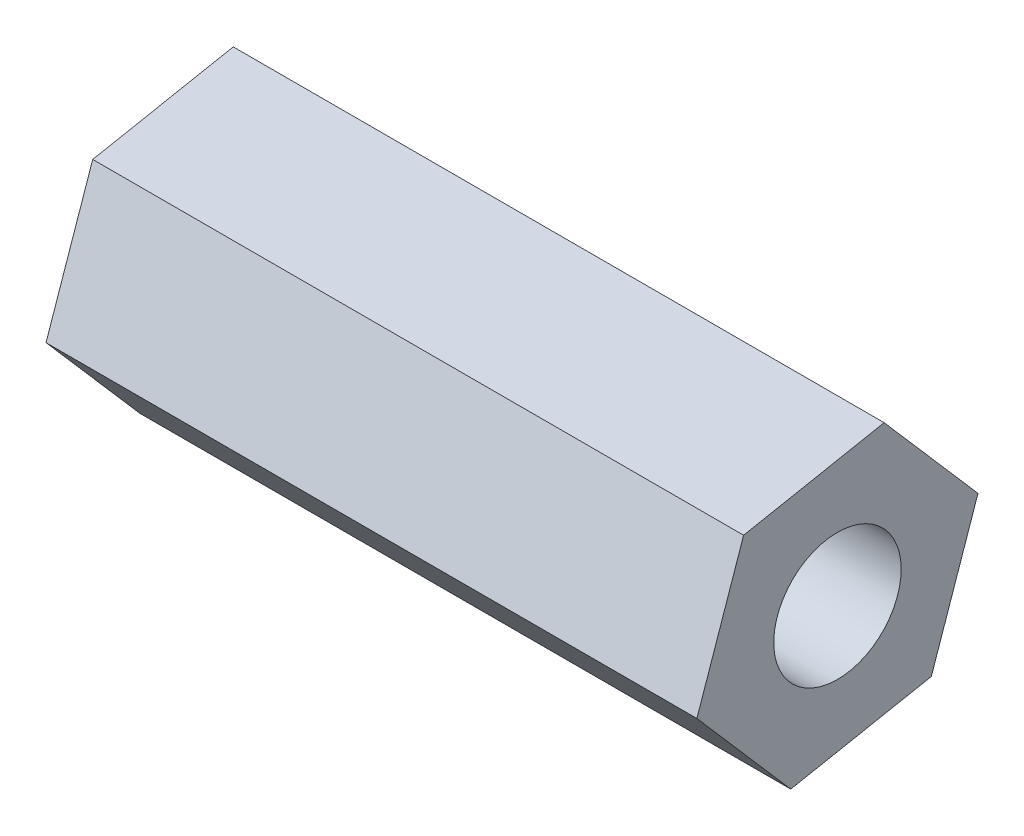
ISO-10303-21;
HEADER;
FILE_DESCRIPTION(('STEP AP214'),'2;1');
FILE_NAME('part.step','',(''),(''),'','','');
FILE_SCHEMA(('AUTOMOTIVE_DESIGN { 1 0 10303 214 1 1 1 1 }'));
ENDSEC;
DATA;
#1=APPLICATION_CONTEXT('core data for automotive mechanical design processes');
#2=APPLICATION_PROTOCOL_DEFINITION('international standard','automotive_design',2000,#1);
#3=PRODUCT_CONTEXT('',#1,'mechanical');
#4=PRODUCT('Part','Part','',(#3));
#5=PRODUCT_RELATED_PRODUCT_CATEGORY('part','',(#4));
#6=PRODUCT_DEFINITION_FORMATION('','',#4);
#7=PRODUCT_DEFINITION_CONTEXT('part definition',#1,'design');
#8=PRODUCT_DEFINITION('design','',#6,#7);
#9=PRODUCT_DEFINITION_SHAPE('','',#8);
#10=(LENGTH_UNIT() NAMED_UNIT(*) SI_UNIT(.MILLI.,.METRE.));
#11=(NAMED_UNIT(*) PLANE_ANGLE_UNIT() SI_UNIT($,.RADIAN.));
#12=(NAMED_UNIT(*) SI_UNIT($,.STERADIAN.) SOLID_ANGLE_UNIT());
#13=UNCERTAINTY_MEASURE_WITH_UNIT(LENGTH_MEASURE(1.E-05),#10,'distance_accuracy_value','');
#14=(GEOMETRIC_REPRESENTATION_CONTEXT(3) GLOBAL_UNCERTAINTY_ASSIGNED_CONTEXT((#13)) GLOBAL_UNIT_ASSIGNED_CONTEXT((#10,
#11,#12)) REPRESENTATION_CONTEXT('',''));
#15=CARTESIAN_POINT('',(0.,0.,0.));
#16=DIRECTION('',(0.,0.,1.));
#17=DIRECTION('',(1.,0.,0.));
#18=AXIS2_PLACEMENT_3D('',#15,#16,#17);
#19=CARTESIAN_POINT('',(33.3375,6.93101609017103,-2.39256124083035));
#20=DIRECTION('',(0.,-0.981775035427216,-0.190046783218998));
#21=DIRECTION('',(0.,0.190046783218998,-0.981775035427216));
#22=AXIS2_PLACEMENT_3D('',#19,#20,#21);
#23=PLANE('',#22);
#24=DIRECTION('',(0.,-0.190046783218998,0.981775035427216));
#25=VECTOR('',#24,1.);
#26=CARTESIAN_POINT('',(0.,6.93101609017103,-2.39256124083035));
#27=LINE('',#26,#25);
#28=CARTESIAN_POINT('',(0.,6.93101609017103,-2.39256124083035));
#29=VERTEX_POINT('',#28);
#30=CARTESIAN_POINT('',(0.,5.53752685975462,4.80615538771163));
#31=VERTEX_POINT('',#30);
#32=EDGE_CURVE('E121',#29,#31,#27,.T.);
#33=ORIENTED_EDGE('',*,*,#32,.T.);
#34=DIRECTION('',(-1.,0.,0.));
#35=VECTOR('',#34,1.);
#36=CARTESIAN_POINT('',(33.3375,5.53752685975462,4.80615538771163));
#37=LINE('',#36,#35);
#38=CARTESIAN_POINT('',(33.3375,5.53752685975462,4.80615538771163));
#39=VERTEX_POINT('',#38);
#40=EDGE_CURVE('E11',#39,#31,#37,.T.);
#41=ORIENTED_EDGE('',*,*,#40,.F.);
#42=DIRECTION('',(0.,-0.190046783218998,0.981775035427216));
#43=VECTOR('',#42,1.);
#44=CARTESIAN_POINT('',(33.3375,6.93101609017103,-2.39256124083035));
#45=LINE('',#44,#43);
#46=CARTESIAN_POINT('',(33.3375,6.93101609017103,-2.39256124083035));
#47=VERTEX_POINT('',#46);
#48=EDGE_CURVE('E131',#47,#39,#45,.T.);
#49=ORIENTED_EDGE('',*,*,#48,.F.);
#50=DIRECTION('',(-1.,0.,0.));
#51=VECTOR('',#50,1.);
#52=CARTESIAN_POINT('',(33.3375,6.93101609017103,-2.39256124083035));
#53=LINE('',#52,#51);
#54=EDGE_CURVE('E117',#47,#29,#53,.T.);
#55=ORIENTED_EDGE('',*,*,#54,.T.);
#56=EDGE_LOOP('',(#33,#41,#49,#55));
#57=FACE_BOUND('',#56,.T.);
#58=ADVANCED_FACE('F36',(#57),#23,.F.);
#59=CARTESIAN_POINT('',(33.3375,5.53752685975462,4.80615538771163));
#60=DIRECTION('',(0.,-0.326302175538441,-0.945265513090835));
#61=DIRECTION('',(0.,0.945265513090836,-0.326302175538441));
#62=AXIS2_PLACEMENT_3D('',#59,#60,#61);
#63=PLANE('',#62);
#64=DIRECTION('',(0.,-0.945265513090835,0.326302175538441));
#65=VECTOR('',#64,1.);
#66=CARTESIAN_POINT('',(0.,5.53752685975462,4.80615538771163));
#67=LINE('',#66,#65);
#68=CARTESIAN_POINT('',(0.,-1.39348923041641,7.19871662854198));
#69=VERTEX_POINT('',#68);
#70=EDGE_CURVE('E124',#31,#69,#67,.T.);
#71=ORIENTED_EDGE('',*,*,#70,.T.);
#72=DIRECTION('',(-1.,0.,0.));
#73=VECTOR('',#72,1.);
#74=CARTESIAN_POINT('',(33.3375,-1.39348923041641,7.19871662854198));
#75=LINE('',#74,#73);
#76=CARTESIAN_POINT('',(33.3375,-1.39348923041641,7.19871662854198));
#77=VERTEX_POINT('',#76);
#78=EDGE_CURVE('E45',#77,#69,#75,.T.);
#79=ORIENTED_EDGE('',*,*,#78,.F.);
#80=DIRECTION('',(0.,-0.945265513090835,0.326302175538441));
#81=VECTOR('',#80,1.);
#82=CARTESIAN_POINT('',(33.3375,5.53752685975462,4.80615538771163));
#83=LINE('',#82,#81);
#84=EDGE_CURVE('E90',#39,#77,#83,.T.);
#85=ORIENTED_EDGE('',*,*,#84,.F.);
#86=ORIENTED_EDGE('',*,*,#40,.T.);
#87=EDGE_LOOP('',(#71,#79,#85,#86));
#88=FACE_BOUND('',#87,.T.);
#89=ADVANCED_FACE('F157',(#88),#63,.F.);
#90=CARTESIAN_POINT('',(33.3375,-1.39348923041641,7.19871662854198));
#91=DIRECTION('',(0.,0.655472859888775,-0.755218729871837));
#92=DIRECTION('',(0.,0.755218729871837,0.655472859888775));
#93=AXIS2_PLACEMENT_3D('',#90,#91,#92);
#94=PLANE('',#93);
#95=DIRECTION('',(0.,-0.755218729871837,-0.655472859888775));
#96=VECTOR('',#95,1.);
#97=CARTESIAN_POINT('',(0.,-1.39348923041641,7.19871662854198));
#98=LINE('',#97,#96);
#99=CARTESIAN_POINT('',(0.,-6.93101609017103,2.39256124083034));
#100=VERTEX_POINT('',#99);
#101=EDGE_CURVE('E126',#69,#100,#98,.T.);
#102=ORIENTED_EDGE('',*,*,#101,.T.);
#103=DIRECTION('',(-1.,0.,0.));
#104=VECTOR('',#103,1.);
#105=CARTESIAN_POINT('',(33.3375,-6.93101609017103,2.39256124083034));
#106=LINE('',#105,#104);
#107=CARTESIAN_POINT('',(33.3375,-6.93101609017103,2.39256124083034));
#108=VERTEX_POINT('',#107);
#109=EDGE_CURVE('E112',#108,#100,#106,.T.);
#110=ORIENTED_EDGE('',*,*,#109,.F.);
#111=DIRECTION('',(0.,-0.755218729871837,-0.655472859888775));
#112=VECTOR('',#111,1.);
#113=CARTESIAN_POINT('',(33.3375,-1.39348923041641,7.19871662854198));
#114=LINE('',#113,#112);
#115=EDGE_CURVE('E103',#77,#108,#114,.T.);
#116=ORIENTED_EDGE('',*,*,#115,.F.);
#117=ORIENTED_EDGE('',*,*,#78,.T.);
#118=EDGE_LOOP('',(#102,#110,#116,#117));
#119=FACE_BOUND('',#118,.T.);
#120=ADVANCED_FACE('F138',(#119),#94,.F.);
#121=CARTESIAN_POINT('',(33.3375,-6.93101609017103,2.39256124083034));
#122=DIRECTION('',(0.,0.981775035427216,0.190046783218998));
#123=DIRECTION('',(0.,-0.190046783218998,0.981775035427216));
#124=AXIS2_PLACEMENT_3D('',#121,#122,#123);
#125=PLANE('',#124);
#126=DIRECTION('',(0.,0.190046783218999,-0.981775035427216));
#127=VECTOR('',#126,1.);
#128=CARTESIAN_POINT('',(0.,-6.93101609017103,2.39256124083034));
#129=LINE('',#128,#127);
#130=CARTESIAN_POINT('',(0.,-5.53752685975462,-4.80615538771163));
#131=VERTEX_POINT('',#130);
#132=EDGE_CURVE('E111',#100,#131,#129,.T.);
#133=ORIENTED_EDGE('',*,*,#132,.T.);
#134=DIRECTION('',(-1.,0.,0.));
#135=VECTOR('',#134,1.);
#136=CARTESIAN_POINT('',(33.3375,-5.53752685975462,-4.80615538771163));
#137=LINE('',#136,#135);
#138=CARTESIAN_POINT('',(33.3375,-5.53752685975462,-4.80615538771163));
#139=VERTEX_POINT('',#138);
#140=EDGE_CURVE('E108',#139,#131,#137,.T.);
#141=ORIENTED_EDGE('',*,*,#140,.F.);
#142=DIRECTION('',(0.,0.190046783218999,-0.981775035427216));
#143=VECTOR('',#142,1.);
#144=CARTESIAN_POINT('',(33.3375,-6.93101609017103,2.39256124083034));
#145=LINE('',#144,#143);
#146=EDGE_CURVE('E97',#108,#139,#145,.T.);
#147=ORIENTED_EDGE('',*,*,#146,.F.);
#148=ORIENTED_EDGE('',*,*,#109,.T.);
#149=EDGE_LOOP('',(#133,#141,#147,#148));
#150=FACE_BOUND('',#149,.T.);
#151=ADVANCED_FACE('F109',(#150),#125,.F.);
#152=CARTESIAN_POINT('',(33.3375,-5.53752685975462,-4.80615538771163));
#153=DIRECTION('',(0.,0.326302175538441,0.945265513090835));
#154=DIRECTION('',(0.,-0.945265513090836,0.326302175538441));
#155=AXIS2_PLACEMENT_3D('',#152,#153,#154);
#156=PLANE('',#155);
#157=DIRECTION('',(0.,0.945265513090836,-0.326302175538441));
#158=VECTOR('',#157,1.);
#159=CARTESIAN_POINT('',(0.,-5.53752685975462,-4.80615538771163));
#160=LINE('',#159,#158);
#161=CARTESIAN_POINT('',(0.,1.39348923041641,-7.19871662854198));
#162=VERTEX_POINT('',#161);
#163=EDGE_CURVE('E76',#131,#162,#160,.T.);
#164=ORIENTED_EDGE('',*,*,#163,.T.);
#165=DIRECTION('',(-1.,0.,0.));
#166=VECTOR('',#165,1.);
#167=CARTESIAN_POINT('',(33.3375,1.39348923041641,-7.19871662854198));
#168=LINE('',#167,#166);
#169=CARTESIAN_POINT('',(33.3375,1.39348923041641,-7.19871662854198));
#170=VERTEX_POINT('',#169);
#171=EDGE_CURVE('E113',#170,#162,#168,.T.);
#172=ORIENTED_EDGE('',*,*,#171,.F.);
#173=DIRECTION('',(0.,0.945265513090836,-0.326302175538441));
#174=VECTOR('',#173,1.);
#175=CARTESIAN_POINT('',(33.3375,-5.53752685975462,-4.80615538771163));
#176=LINE('',#175,#174);
#177=EDGE_CURVE('E101',#139,#170,#176,.T.);
#178=ORIENTED_EDGE('',*,*,#177,.F.);
#179=ORIENTED_EDGE('',*,*,#140,.T.);
#180=EDGE_LOOP('',(#164,#172,#178,#179));
#181=FACE_BOUND('',#180,.T.);
#182=ADVANCED_FACE('F115',(#181),#156,.F.);
#183=CARTESIAN_POINT('',(33.3375,1.39348923041641,-7.19871662854198));
#184=DIRECTION('',(0.,-0.655472859888775,0.755218729871837));
#185=DIRECTION('',(0.,-0.755218729871837,-0.655472859888775));
#186=AXIS2_PLACEMENT_3D('',#183,#184,#185);
#187=PLANE('',#186);
#188=DIRECTION('',(0.,0.755218729871837,0.655472859888775));
#189=VECTOR('',#188,1.);
#190=CARTESIAN_POINT('',(0.,1.39348923041641,-7.19871662854198));
#191=LINE('',#190,#189);
#192=EDGE_CURVE('E82',#162,#29,#191,.T.);
#193=ORIENTED_EDGE('',*,*,#192,.T.);
#194=ORIENTED_EDGE('',*,*,#54,.F.);
#195=DIRECTION('',(0.,0.755218729871837,0.655472859888775));
#196=VECTOR('',#195,1.);
#197=CARTESIAN_POINT('',(33.3375,1.39348923041641,-7.19871662854198));
#198=LINE('',#197,#196);
#199=EDGE_CURVE('E53',#170,#47,#198,.T.);
#200=ORIENTED_EDGE('',*,*,#199,.F.);
#201=ORIENTED_EDGE('',*,*,#171,.T.);
#202=EDGE_LOOP('',(#193,#194,#200,#201));
#203=FACE_BOUND('',#202,.T.);
#204=ADVANCED_FACE('F145',(#203),#187,.F.);
#205=CARTESIAN_POINT('',(33.3375,0.,0.));
#206=DIRECTION('',(1.,0.,0.));
#207=DIRECTION('',(0.,0.,-1.));
#208=AXIS2_PLACEMENT_3D('',#205,#206,#207);
#209=PLANE('',#208);
#210=CARTESIAN_POINT('',(33.3375,0.,0.));
#211=DIRECTION('',(1.,0.,0.));
#212=DIRECTION('',(0.,0.,-1.));
#213=AXIS2_PLACEMENT_3D('',#210,#211,#212);
#214=CIRCLE('',#213,3.2639);
#215=CARTESIAN_POINT('',(33.3375,0.,-3.2639));
#216=VERTEX_POINT('',#215);
#217=EDGE_CURVE('E210',#216,#216,#214,.T.);
#218=ORIENTED_EDGE('',*,*,#217,.F.);
#219=EDGE_LOOP('',(#218));
#220=FACE_BOUND('',#219,.T.);
#221=ORIENTED_EDGE('',*,*,#48,.T.);
#222=ORIENTED_EDGE('',*,*,#84,.T.);
#223=ORIENTED_EDGE('',*,*,#115,.T.);
#224=ORIENTED_EDGE('',*,*,#146,.T.);
#225=ORIENTED_EDGE('',*,*,#177,.T.);
#226=ORIENTED_EDGE('',*,*,#199,.T.);
#227=EDGE_LOOP('',(#221,#222,#223,#224,#225,#226));
#228=FACE_BOUND('',#227,.T.);
#229=ADVANCED_FACE('F99',(#220,#228),#209,.T.);
#230=CARTESIAN_POINT('',(0.,0.,0.));
#231=DIRECTION('',(1.,0.,0.));
#232=DIRECTION('',(0.,0.,-1.));
#233=AXIS2_PLACEMENT_3D('',#230,#231,#232);
#234=PLANE('',#233);
#235=CARTESIAN_POINT('',(0.,0.,0.));
#236=DIRECTION('',(1.,0.,0.));
#237=DIRECTION('',(0.,0.,-1.));
#238=AXIS2_PLACEMENT_3D('',#235,#236,#237);
#239=CIRCLE('',#238,3.2639);
#240=CARTESIAN_POINT('',(0.,0.,-3.2639));
#241=VERTEX_POINT('',#240);
#242=EDGE_CURVE('E39',#241,#241,#239,.T.);
#243=ORIENTED_EDGE('',*,*,#242,.T.);
#244=EDGE_LOOP('',(#243));
#245=FACE_BOUND('',#244,.T.);
#246=ORIENTED_EDGE('',*,*,#32,.F.);
#247=ORIENTED_EDGE('',*,*,#192,.F.);
#248=ORIENTED_EDGE('',*,*,#163,.F.);
#249=ORIENTED_EDGE('',*,*,#132,.F.);
#250=ORIENTED_EDGE('',*,*,#101,.F.);
#251=ORIENTED_EDGE('',*,*,#70,.F.);
#252=EDGE_LOOP('',(#246,#247,#248,#249,#250,#251));
#253=FACE_BOUND('',#252,.T.);
#254=ADVANCED_FACE('F141',(#245,#253),#234,.F.);
#255=CARTESIAN_POINT('',(-4.7625,0.,0.));
#256=DIRECTION('',(1.,0.,0.));
#257=DIRECTION('',(0.,0.,-1.));
#258=AXIS2_PLACEMENT_3D('',#255,#256,#257);
#259=CYLINDRICAL_SURFACE('',#258,3.2639);
#260=CARTESIAN_POINT('',(33.3375,0.,-3.2639));
#261=CARTESIAN_POINT('',(32.990234375,0.,-3.2639));
#262=CARTESIAN_POINT('',(32.64296875,0.,-3.2639));
#263=CARTESIAN_POINT('',(31.9484375,0.,-3.2639));
#264=CARTESIAN_POINT('',(31.601171875,0.,-3.2639));
#265=CARTESIAN_POINT('',(30.906640625,0.,-3.2639));
#266=CARTESIAN_POINT('',(30.559375,0.,-3.2639));
#267=CARTESIAN_POINT('',(29.86484375,0.,-3.2639));
#268=CARTESIAN_POINT('',(29.517578125,0.,-3.2639));
#269=CARTESIAN_POINT('',(28.823046875,0.,-3.2639));
#270=CARTESIAN_POINT('',(28.47578125,0.,-3.2639));
#271=CARTESIAN_POINT('',(27.78125,0.,-3.2639));
#272=CARTESIAN_POINT('',(27.433984375,0.,-3.2639));
#273=CARTESIAN_POINT('',(26.739453125,0.,-3.2639));
#274=CARTESIAN_POINT('',(26.3921875,0.,-3.2639));
#275=CARTESIAN_POINT('',(25.69765625,0.,-3.2639));
#276=CARTESIAN_POINT('',(25.350390625,0.,-3.2639));
#277=CARTESIAN_POINT('',(24.655859375,0.,-3.2639));
#278=CARTESIAN_POINT('',(24.30859375,0.,-3.2639));
#279=CARTESIAN_POINT('',(23.6140625,0.,-3.2639));
#280=CARTESIAN_POINT('',(23.266796875,0.,-3.2639));
#281=CARTESIAN_POINT('',(22.572265625,0.,-3.2639));
#282=CARTESIAN_POINT('',(22.225,0.,-3.2639));
#283=CARTESIAN_POINT('',(21.53046875,0.,-3.2639));
#284=CARTESIAN_POINT('',(21.183203125,0.,-3.2639));
#285=CARTESIAN_POINT('',(20.488671875,0.,-3.2639));
#286=CARTESIAN_POINT('',(20.14140625,0.,-3.2639));
#287=CARTESIAN_POINT('',(19.446875,0.,-3.2639));
#288=CARTESIAN_POINT('',(19.099609375,0.,-3.2639));
#289=CARTESIAN_POINT('',(18.405078125,0.,-3.2639));
#290=CARTESIAN_POINT('',(18.0578125,0.,-3.2639));
#291=CARTESIAN_POINT('',(17.36328125,0.,-3.2639));
#292=CARTESIAN_POINT('',(17.016015625,0.,-3.2639));
#293=CARTESIAN_POINT('',(16.321484375,0.,-3.2639));
#294=CARTESIAN_POINT('',(15.97421875,0.,-3.2639));
#295=CARTESIAN_POINT('',(15.2796875,0.,-3.2639));
#296=CARTESIAN_POINT('',(14.932421875,0.,-3.2639));
#297=CARTESIAN_POINT('',(14.237890625,0.,-3.2639));
#298=CARTESIAN_POINT('',(13.890625,0.,-3.2639));
#299=CARTESIAN_POINT('',(13.19609375,0.,-3.2639));
#300=CARTESIAN_POINT('',(12.848828125,0.,-3.2639));
#301=CARTESIAN_POINT('',(12.154296875,0.,-3.2639));
#302=CARTESIAN_POINT('',(11.80703125,0.,-3.2639));
#303=CARTESIAN_POINT('',(11.1125,0.,-3.2639));
#304=CARTESIAN_POINT('',(10.765234375,0.,-3.2639));
#305=CARTESIAN_POINT('',(10.070703125,0.,-3.2639));
#306=CARTESIAN_POINT('',(9.7234375,0.,-3.2639));
#307=CARTESIAN_POINT('',(9.02890625,0.,-3.2639));
#308=CARTESIAN_POINT('',(8.681640625,0.,-3.2639));
#309=CARTESIAN_POINT('',(7.987109375,0.,-3.2639));
#310=CARTESIAN_POINT('',(7.63984375,0.,-3.2639));
#311=CARTESIAN_POINT('',(6.9453125,0.,-3.2639));
#312=CARTESIAN_POINT('',(6.598046875,0.,-3.2639));
#313=CARTESIAN_POINT('',(5.903515625,0.,-3.2639));
#314=CARTESIAN_POINT('',(5.55625,0.,-3.2639));
#315=CARTESIAN_POINT('',(4.86171875,0.,-3.2639));
#316=CARTESIAN_POINT('',(4.514453125,0.,-3.2639));
#317=CARTESIAN_POINT('',(3.819921875,0.,-3.2639));
#318=CARTESIAN_POINT('',(3.47265625,0.,-3.2639));
#319=CARTESIAN_POINT('',(2.778125,0.,-3.2639));
#320=CARTESIAN_POINT('',(2.430859375,0.,-3.2639));
#321=CARTESIAN_POINT('',(1.736328125,0.,-3.2639));
#322=CARTESIAN_POINT('',(1.3890625,0.,-3.2639));
#323=CARTESIAN_POINT('',(0.69453125,0.,-3.2639));
#324=CARTESIAN_POINT('',(0.347265625,0.,-3.2639));
#325=CARTESIAN_POINT('',(0.,0.,-3.2639));
#326=B_SPLINE_CURVE_WITH_KNOTS('',3,(#260,#261,#262,#263,#264,#265,#266,#267,#268,#269,#270,
#271,#272,#273,#274,#275,#276,#277,#278,#279,#280,#281,#282,#283,#284,#285,#286,#287,#288,#289,
#290,#291,#292,#293,#294,#295,#296,#297,#298,#299,#300,#301,#302,#303,#304,#305,#306,#307,#308,
#309,#310,#311,#312,#313,#314,#315,#316,#317,#318,#319,#320,#321,#322,#323,#324,#325),
.UNSPECIFIED.,.F.,.F.,(4,2,2,2,2,2,2,2,2,2,2,2,2,2,2,2,2,2,2,2,2,2,2,2,2,2,2,2,2,2,2,2,4),(0.,
1.041796875,2.08359375,3.125390625,4.1671875,5.208984375,6.25078125,7.292578125,8.334375,
9.376171875,10.41796875,11.459765625,12.5015625,13.543359375,14.58515625,15.626953125,16.66875,
17.710546875,18.75234375,19.794140625,20.8359375,21.877734375,22.91953125,23.961328125,
25.003125,26.044921875,27.08671875,28.128515625,29.1703125,30.212109375,31.25390625,
32.295703125,33.3375),.UNSPECIFIED.);
#327=EDGE_CURVE('BSEAM194',#216,#241,#326,.T.);
#328=ORIENTED_EDGE('',*,*,#217,.T.);
#329=ORIENTED_EDGE('',*,*,#242,.F.);
#330=ORIENTED_EDGE('',*,*,#327,.T.);
#331=ORIENTED_EDGE('',*,*,#327,.F.);
#332=EDGE_LOOP('',(#328,#330,#329,#331));
#333=FACE_BOUND('',#332,.T.);
#334=ADVANCED_FACE('F194',(#333),#259,.F.);
#335=CLOSED_SHELL('',(#58,#89,#120,#151,#182,#204,#229,#254,#334));
#336=MANIFOLD_SOLID_BREP('B2',#335);
#337=ADVANCED_BREP_SHAPE_REPRESENTATION('',(#18,#336),#14);
#338=SHAPE_DEFINITION_REPRESENTATION(#9,#337);
ENDSEC;
END-ISO-10303-21;
